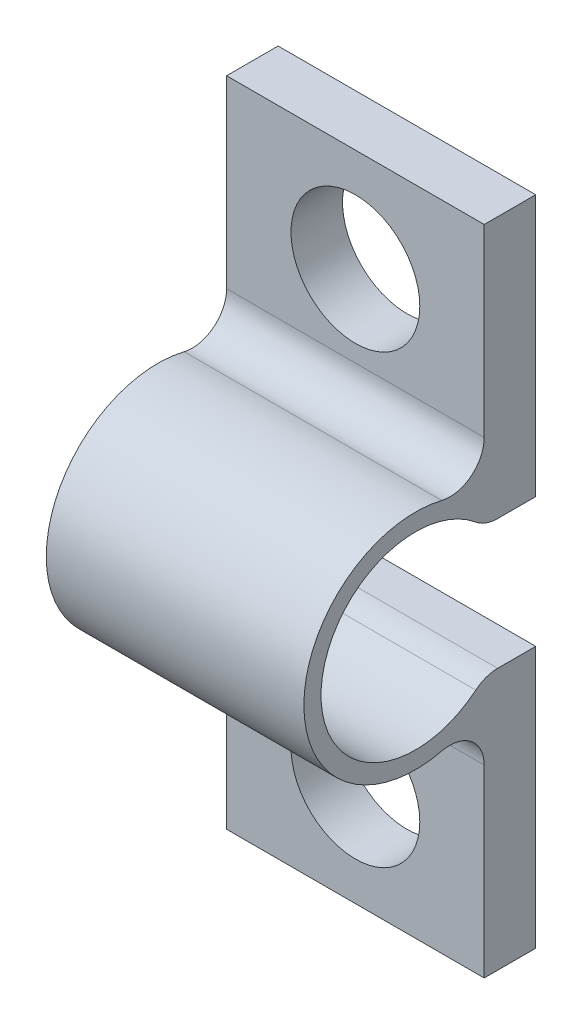
ISO-10303-21;
HEADER;
FILE_DESCRIPTION(('STEP AP214'),'2;1');
FILE_NAME('part.step','',(''),(''),'','','');
FILE_SCHEMA(('AUTOMOTIVE_DESIGN { 1 0 10303 214 1 1 1 1 }'));
ENDSEC;
DATA;
#1=APPLICATION_CONTEXT('core data for automotive mechanical design processes');
#2=APPLICATION_PROTOCOL_DEFINITION('international standard','automotive_design',2000,#1);
#3=PRODUCT_CONTEXT('',#1,'mechanical');
#4=PRODUCT('Part','Part','',(#3));
#5=PRODUCT_RELATED_PRODUCT_CATEGORY('part','',(#4));
#6=PRODUCT_DEFINITION_FORMATION('','',#4);
#7=PRODUCT_DEFINITION_CONTEXT('part definition',#1,'design');
#8=PRODUCT_DEFINITION('design','',#6,#7);
#9=PRODUCT_DEFINITION_SHAPE('','',#8);
#10=(LENGTH_UNIT() NAMED_UNIT(*) SI_UNIT(.MILLI.,.METRE.));
#11=(NAMED_UNIT(*) PLANE_ANGLE_UNIT() SI_UNIT($,.RADIAN.));
#12=(NAMED_UNIT(*) SI_UNIT($,.STERADIAN.) SOLID_ANGLE_UNIT());
#13=UNCERTAINTY_MEASURE_WITH_UNIT(LENGTH_MEASURE(1.E-05),#10,'distance_accuracy_value','');
#14=(GEOMETRIC_REPRESENTATION_CONTEXT(3) GLOBAL_UNCERTAINTY_ASSIGNED_CONTEXT((#13)) GLOBAL_UNIT_ASSIGNED_CONTEXT((#10,
#11,#12)) REPRESENTATION_CONTEXT('',''));
#15=CARTESIAN_POINT('',(0.,0.,0.));
#16=DIRECTION('',(0.,0.,1.));
#17=DIRECTION('',(1.,0.,0.));
#18=AXIS2_PLACEMENT_3D('',#15,#16,#17);
#19=CARTESIAN_POINT('',(0.,0.,0.));
#20=DIRECTION('',(0.,0.,-1.));
#21=DIRECTION('',(-1.,0.,0.));
#22=AXIS2_PLACEMENT_3D('',#19,#20,#21);
#23=PLANE('',#22);
#24=DIRECTION('',(1.,0.,0.));
#25=VECTOR('',#24,1.);
#26=CARTESIAN_POINT('',(0.,3.77491721763538,0.));
#27=LINE('',#26,#25);
#28=CARTESIAN_POINT('',(-35.5,3.77491721763538,0.));
#29=VERTEX_POINT('',#28);
#30=CARTESIAN_POINT('',(-20.5,3.77491721763538,0.));
#31=VERTEX_POINT('',#30);
#32=EDGE_CURVE('E180',#29,#31,#27,.T.);
#33=ORIENTED_EDGE('',*,*,#32,.F.);
#34=DIRECTION('',(0.,1.,0.));
#35=VECTOR('',#34,1.);
#36=CARTESIAN_POINT('',(-35.5,-19.,0.));
#37=LINE('',#36,#35);
#38=CARTESIAN_POINT('',(-35.5,19.,0.));
#39=VERTEX_POINT('',#38);
#40=EDGE_CURVE('E196',#29,#39,#37,.T.);
#41=ORIENTED_EDGE('',*,*,#40,.T.);
#42=DIRECTION('',(1.,0.,0.));
#43=VECTOR('',#42,1.);
#44=CARTESIAN_POINT('',(-35.5,19.,0.));
#45=LINE('',#44,#43);
#46=CARTESIAN_POINT('',(-20.5,19.,0.));
#47=VERTEX_POINT('',#46);
#48=EDGE_CURVE('E195',#39,#47,#45,.T.);
#49=ORIENTED_EDGE('',*,*,#48,.T.);
#50=DIRECTION('',(0.,-1.,0.));
#51=VECTOR('',#50,1.);
#52=CARTESIAN_POINT('',(-20.5,13.,0.));
#53=LINE('',#52,#51);
#54=EDGE_CURVE('E206',#47,#31,#53,.T.);
#55=ORIENTED_EDGE('',*,*,#54,.T.);
#56=EDGE_LOOP('',(#33,#41,#49,#55));
#57=FACE_BOUND('',#56,.T.);
#58=CARTESIAN_POINT('',(-28.,13.,0.));
#59=DIRECTION('',(0.,0.,1.));
#60=DIRECTION('',(1.,0.,0.));
#61=AXIS2_PLACEMENT_3D('',#58,#59,#60);
#62=CIRCLE('',#61,3.75);
#63=CARTESIAN_POINT('',(-24.25,13.,0.));
#64=VERTEX_POINT('',#63);
#65=EDGE_CURVE('E344',#64,#64,#62,.T.);
#66=ORIENTED_EDGE('',*,*,#65,.T.);
#67=EDGE_LOOP('',(#66));
#68=FACE_BOUND('',#67,.T.);
#69=ADVANCED_FACE('F72',(#57,#68),#23,.T.);
#70=CARTESIAN_POINT('',(0.,0.,3.));
#71=DIRECTION('',(0.,0.,-1.));
#72=DIRECTION('',(-1.,0.,0.));
#73=AXIS2_PLACEMENT_3D('',#70,#71,#72);
#74=PLANE('',#73);
#75=CARTESIAN_POINT('',(-28.,-13.,3.));
#76=DIRECTION('',(0.,0.,1.));
#77=DIRECTION('',(1.,0.,0.));
#78=AXIS2_PLACEMENT_3D('',#75,#76,#77);
#79=CIRCLE('',#78,3.75);
#80=CARTESIAN_POINT('',(-24.25,-13.,3.));
#81=VERTEX_POINT('',#80);
#82=EDGE_CURVE('E341',#81,#81,#79,.T.);
#83=ORIENTED_EDGE('',*,*,#82,.F.);
#84=EDGE_LOOP('',(#83));
#85=FACE_BOUND('',#84,.T.);
#86=DIRECTION('',(0.,1.,0.));
#87=VECTOR('',#86,1.);
#88=CARTESIAN_POINT('',(-20.5,13.,3.));
#89=LINE('',#88,#87);
#90=CARTESIAN_POINT('',(-20.5,-19.,3.));
#91=VERTEX_POINT('',#90);
#92=CARTESIAN_POINT('',(-20.5,-8.26135582092915,3.));
#93=VERTEX_POINT('',#92);
#94=EDGE_CURVE('E357',#91,#93,#89,.T.);
#95=ORIENTED_EDGE('',*,*,#94,.T.);
#96=DIRECTION('',(-1.,0.,0.));
#97=VECTOR('',#96,1.);
#98=CARTESIAN_POINT('',(0.,-8.26135582092915,3.));
#99=LINE('',#98,#97);
#100=CARTESIAN_POINT('',(-35.5,-8.26135582092915,3.));
#101=VERTEX_POINT('',#100);
#102=EDGE_CURVE('E229',#93,#101,#99,.T.);
#103=ORIENTED_EDGE('',*,*,#102,.T.);
#104=DIRECTION('',(0.,1.,0.));
#105=VECTOR('',#104,1.);
#106=CARTESIAN_POINT('',(-35.5,-19.,3.));
#107=LINE('',#106,#105);
#108=CARTESIAN_POINT('',(-35.5,-19.,3.));
#109=VERTEX_POINT('',#108);
#110=EDGE_CURVE('E351',#109,#101,#107,.T.);
#111=ORIENTED_EDGE('',*,*,#110,.F.);
#112=DIRECTION('',(1.,0.,0.));
#113=VECTOR('',#112,1.);
#114=CARTESIAN_POINT('',(-35.5,-19.,3.));
#115=LINE('',#114,#113);
#116=EDGE_CURVE('E203',#109,#91,#115,.T.);
#117=ORIENTED_EDGE('',*,*,#116,.T.);
#118=EDGE_LOOP('',(#95,#103,#111,#117));
#119=FACE_BOUND('',#118,.T.);
#120=ADVANCED_FACE('F275',(#85,#119),#74,.F.);
#121=CARTESIAN_POINT('',(-35.5,8.26135582092916,3.));
#122=VERTEX_POINT('',#121);
#123=CARTESIAN_POINT('',(-35.5,19.,3.));
#124=VERTEX_POINT('',#123);
#125=EDGE_CURVE('E210',#122,#124,#107,.T.);
#126=ORIENTED_EDGE('',*,*,#125,.F.);
#127=DIRECTION('',(-1.,0.,0.));
#128=VECTOR('',#127,1.);
#129=CARTESIAN_POINT('',(0.,8.26135582092915,3.));
#130=LINE('',#129,#128);
#131=CARTESIAN_POINT('',(-20.5,8.26135582092915,3.));
#132=VERTEX_POINT('',#131);
#133=EDGE_CURVE('E213',#122,#132,#130,.F.);
#134=ORIENTED_EDGE('',*,*,#133,.T.);
#135=CARTESIAN_POINT('',(-20.5,19.,3.));
#136=VERTEX_POINT('',#135);
#137=EDGE_CURVE('E356',#132,#136,#89,.T.);
#138=ORIENTED_EDGE('',*,*,#137,.T.);
#139=DIRECTION('',(1.,0.,0.));
#140=VECTOR('',#139,1.);
#141=CARTESIAN_POINT('',(-35.5,19.,3.));
#142=LINE('',#141,#140);
#143=EDGE_CURVE('E354',#124,#136,#142,.T.);
#144=ORIENTED_EDGE('',*,*,#143,.F.);
#145=EDGE_LOOP('',(#126,#134,#138,#144));
#146=FACE_BOUND('',#145,.T.);
#147=CARTESIAN_POINT('',(-28.,13.,3.));
#148=DIRECTION('',(0.,0.,1.));
#149=DIRECTION('',(1.,0.,0.));
#150=AXIS2_PLACEMENT_3D('',#147,#148,#149);
#151=CIRCLE('',#150,3.75);
#152=CARTESIAN_POINT('',(-24.25,13.,3.));
#153=VERTEX_POINT('',#152);
#154=EDGE_CURVE('E201',#153,#153,#151,.T.);
#155=ORIENTED_EDGE('',*,*,#154,.F.);
#156=EDGE_LOOP('',(#155));
#157=FACE_BOUND('',#156,.T.);
#158=ADVANCED_FACE('F281',(#146,#157),#74,.F.);
#159=DIRECTION('',(-1.,0.,0.));
#160=VECTOR('',#159,1.);
#161=CARTESIAN_POINT('',(0.,-3.77491721763537,0.));
#162=LINE('',#161,#160);
#163=CARTESIAN_POINT('',(-20.5,-3.77491721763537,0.));
#164=VERTEX_POINT('',#163);
#165=CARTESIAN_POINT('',(-35.5,-3.77491721763537,0.));
#166=VERTEX_POINT('',#165);
#167=EDGE_CURVE('E172',#164,#166,#162,.T.);
#168=ORIENTED_EDGE('',*,*,#167,.F.);
#169=CARTESIAN_POINT('',(-20.5,-19.,0.));
#170=VERTEX_POINT('',#169);
#171=EDGE_CURVE('E199',#164,#170,#53,.T.);
#172=ORIENTED_EDGE('',*,*,#171,.T.);
#173=DIRECTION('',(1.,0.,0.));
#174=VECTOR('',#173,1.);
#175=CARTESIAN_POINT('',(-35.5,-19.,0.));
#176=LINE('',#175,#174);
#177=CARTESIAN_POINT('',(-35.5,-19.,0.));
#178=VERTEX_POINT('',#177);
#179=EDGE_CURVE('E194',#178,#170,#176,.T.);
#180=ORIENTED_EDGE('',*,*,#179,.F.);
#181=EDGE_CURVE('E187',#178,#166,#37,.T.);
#182=ORIENTED_EDGE('',*,*,#181,.T.);
#183=EDGE_LOOP('',(#168,#172,#180,#182));
#184=FACE_BOUND('',#183,.T.);
#185=CARTESIAN_POINT('',(-28.,-13.,0.));
#186=DIRECTION('',(0.,0.,1.));
#187=DIRECTION('',(1.,0.,0.));
#188=AXIS2_PLACEMENT_3D('',#185,#186,#187);
#189=CIRCLE('',#188,3.75);
#190=CARTESIAN_POINT('',(-24.25,-13.,0.));
#191=VERTEX_POINT('',#190);
#192=EDGE_CURVE('E338',#191,#191,#189,.T.);
#193=ORIENTED_EDGE('',*,*,#192,.T.);
#194=EDGE_LOOP('',(#193));
#195=FACE_BOUND('',#194,.T.);
#196=ADVANCED_FACE('F191',(#184,#195),#23,.T.);
#197=CARTESIAN_POINT('',(-35.5,-19.,3.));
#198=DIRECTION('',(-1.,0.,0.));
#199=DIRECTION('',(0.,0.,1.));
#200=AXIS2_PLACEMENT_3D('',#197,#198,#199);
#201=PLANE('',#200);
#202=CARTESIAN_POINT('',(-35.5,0.,7.));
#203=DIRECTION('',(-1.,0.,0.));
#204=DIRECTION('',(0.,0.,1.));
#205=AXIS2_PLACEMENT_3D('',#202,#203,#204);
#206=CIRCLE('',#205,5.5);
#207=CARTESIAN_POINT('',(-35.5,-4.23493929293261,3.4906853681701));
#208=VERTEX_POINT('',#207);
#209=CARTESIAN_POINT('',(-35.5,4.23493929293261,3.4906853681701));
#210=VERTEX_POINT('',#209);
#211=EDGE_CURVE('E261',#208,#210,#206,.T.);
#212=ORIENTED_EDGE('',*,*,#211,.F.);
#213=CARTESIAN_POINT('',(-35.5,-5.77491721763537,2.21457095659558));
#214=DIRECTION('',(-1.,0.,0.));
#215=DIRECTION('',(0.,0.,1.));
#216=AXIS2_PLACEMENT_3D('',#213,#214,#215);
#217=CIRCLE('',#216,2.);
#218=CARTESIAN_POINT('',(-35.5,-3.77491721763537,2.21457095659558));
#219=VERTEX_POINT('',#218);
#220=EDGE_CURVE('E188',#208,#219,#217,.T.);
#221=ORIENTED_EDGE('',*,*,#220,.T.);
#222=DIRECTION('',(0.,0.,1.));
#223=VECTOR('',#222,1.);
#224=CARTESIAN_POINT('',(-35.5,-3.77491721763537,-12.));
#225=LINE('',#224,#223);
#226=EDGE_CURVE('E175',#166,#219,#225,.T.);
#227=ORIENTED_EDGE('',*,*,#226,.F.);
#228=ORIENTED_EDGE('',*,*,#181,.F.);
#229=DIRECTION('',(0.,0.,-1.));
#230=VECTOR('',#229,1.);
#231=CARTESIAN_POINT('',(-35.5,-19.,3.));
#232=LINE('',#231,#230);
#233=EDGE_CURVE('E211',#109,#178,#232,.T.);
#234=ORIENTED_EDGE('',*,*,#233,.F.);
#235=ORIENTED_EDGE('',*,*,#110,.T.);
#236=CARTESIAN_POINT('',(-35.5,-8.26135582092915,5.));
#237=DIRECTION('',(-1.,0.,0.));
#238=DIRECTION('',(0.,0.,1.));
#239=AXIS2_PLACEMENT_3D('',#236,#237,#238);
#240=CIRCLE('',#239,2.);
#241=CARTESIAN_POINT('',(-35.5,-6.31750739247523,5.47058823529412));
#242=VERTEX_POINT('',#241);
#243=EDGE_CURVE('E236',#101,#242,#240,.F.);
#244=ORIENTED_EDGE('',*,*,#243,.T.);
#245=CARTESIAN_POINT('',(-35.5,0.,7.));
#246=DIRECTION('',(-1.,0.,0.));
#247=DIRECTION('',(0.,0.,1.));
#248=AXIS2_PLACEMENT_3D('',#245,#246,#247);
#249=CIRCLE('',#248,6.5);
#250=CARTESIAN_POINT('',(-35.5,6.31750739247524,5.47058823529412));
#251=VERTEX_POINT('',#250);
#252=EDGE_CURVE('E260',#242,#251,#249,.T.);
#253=ORIENTED_EDGE('',*,*,#252,.T.);
#254=CARTESIAN_POINT('',(-35.5,8.26135582092915,5.));
#255=DIRECTION('',(-1.,0.,0.));
#256=DIRECTION('',(0.,0.,1.));
#257=AXIS2_PLACEMENT_3D('',#254,#255,#256);
#258=CIRCLE('',#257,2.);
#259=EDGE_CURVE('E234',#251,#122,#258,.F.);
#260=ORIENTED_EDGE('',*,*,#259,.T.);
#261=ORIENTED_EDGE('',*,*,#125,.T.);
#262=DIRECTION('',(0.,0.,-1.));
#263=VECTOR('',#262,1.);
#264=CARTESIAN_POINT('',(-35.5,19.,3.));
#265=LINE('',#264,#263);
#266=EDGE_CURVE('E220',#124,#39,#265,.T.);
#267=ORIENTED_EDGE('',*,*,#266,.T.);
#268=ORIENTED_EDGE('',*,*,#40,.F.);
#269=DIRECTION('',(0.,0.,1.));
#270=VECTOR('',#269,1.);
#271=CARTESIAN_POINT('',(-35.5,3.77491721763538,-12.));
#272=LINE('',#271,#270);
#273=CARTESIAN_POINT('',(-35.5,3.77491721763538,2.21457095659558));
#274=VERTEX_POINT('',#273);
#275=EDGE_CURVE('E181',#29,#274,#272,.T.);
#276=ORIENTED_EDGE('',*,*,#275,.T.);
#277=CARTESIAN_POINT('',(-35.5,5.77491721763538,2.21457095659558));
#278=DIRECTION('',(-1.,0.,0.));
#279=DIRECTION('',(0.,0.,1.));
#280=AXIS2_PLACEMENT_3D('',#277,#278,#279);
#281=CIRCLE('',#280,2.);
#282=EDGE_CURVE('E246',#274,#210,#281,.T.);
#283=ORIENTED_EDGE('',*,*,#282,.T.);
#284=EDGE_LOOP('',(#212,#221,#227,#228,#234,#235,#244,#253,#260,#261,#267,#268,#276,#283));
#285=FACE_BOUND('',#284,.T.);
#286=ADVANCED_FACE('F186',(#285),#201,.T.);
#287=CARTESIAN_POINT('',(-35.5,-19.,3.));
#288=DIRECTION('',(0.,1.,0.));
#289=DIRECTION('',(0.,0.,1.));
#290=AXIS2_PLACEMENT_3D('',#287,#288,#289);
#291=PLANE('',#290);
#292=ORIENTED_EDGE('',*,*,#179,.T.);
#293=DIRECTION('',(0.,0.,-1.));
#294=VECTOR('',#293,1.);
#295=CARTESIAN_POINT('',(-20.5,-19.,3.));
#296=LINE('',#295,#294);
#297=EDGE_CURVE('E214',#91,#170,#296,.T.);
#298=ORIENTED_EDGE('',*,*,#297,.F.);
#299=ORIENTED_EDGE('',*,*,#116,.F.);
#300=ORIENTED_EDGE('',*,*,#233,.T.);
#301=EDGE_LOOP('',(#292,#298,#299,#300));
#302=FACE_BOUND('',#301,.T.);
#303=ADVANCED_FACE('F293',(#302),#291,.F.);
#304=CARTESIAN_POINT('',(-20.5,13.,3.));
#305=DIRECTION('',(1.,0.,0.));
#306=DIRECTION('',(0.,0.,-1.));
#307=AXIS2_PLACEMENT_3D('',#304,#305,#306);
#308=PLANE('',#307);
#309=DIRECTION('',(0.,0.,1.));
#310=VECTOR('',#309,1.);
#311=CARTESIAN_POINT('',(-20.5,-3.77491721763537,-12.));
#312=LINE('',#311,#310);
#313=CARTESIAN_POINT('',(-20.5,-3.77491721763537,2.21457095659558));
#314=VERTEX_POINT('',#313);
#315=EDGE_CURVE('E176',#164,#314,#312,.T.);
#316=ORIENTED_EDGE('',*,*,#315,.T.);
#317=CARTESIAN_POINT('',(-20.5,-5.77491721763537,2.21457095659558));
#318=DIRECTION('',(1.,0.,0.));
#319=DIRECTION('',(0.,0.,-1.));
#320=AXIS2_PLACEMENT_3D('',#317,#318,#319);
#321=CIRCLE('',#320,2.);
#322=CARTESIAN_POINT('',(-20.5,-4.23493929293261,3.4906853681701));
#323=VERTEX_POINT('',#322);
#324=EDGE_CURVE('E80',#314,#323,#321,.T.);
#325=ORIENTED_EDGE('',*,*,#324,.T.);
#326=CARTESIAN_POINT('',(-20.5,0.,7.));
#327=DIRECTION('',(-1.,0.,0.));
#328=DIRECTION('',(0.,0.,1.));
#329=AXIS2_PLACEMENT_3D('',#326,#327,#328);
#330=CIRCLE('',#329,5.5);
#331=CARTESIAN_POINT('',(-20.5,4.23493929293261,3.4906853681701));
#332=VERTEX_POINT('',#331);
#333=EDGE_CURVE('E253',#323,#332,#330,.T.);
#334=ORIENTED_EDGE('',*,*,#333,.T.);
#335=CARTESIAN_POINT('',(-20.5,5.77491721763538,2.21457095659558));
#336=DIRECTION('',(1.,0.,0.));
#337=DIRECTION('',(0.,0.,-1.));
#338=AXIS2_PLACEMENT_3D('',#335,#336,#337);
#339=CIRCLE('',#338,2.);
#340=CARTESIAN_POINT('',(-20.5,3.77491721763538,2.21457095659558));
#341=VERTEX_POINT('',#340);
#342=EDGE_CURVE('E87',#332,#341,#339,.T.);
#343=ORIENTED_EDGE('',*,*,#342,.T.);
#344=DIRECTION('',(0.,0.,1.));
#345=VECTOR('',#344,1.);
#346=CARTESIAN_POINT('',(-20.5,3.77491721763538,-12.));
#347=LINE('',#346,#345);
#348=EDGE_CURVE('E326',#31,#341,#347,.T.);
#349=ORIENTED_EDGE('',*,*,#348,.F.);
#350=ORIENTED_EDGE('',*,*,#54,.F.);
#351=DIRECTION('',(0.,0.,-1.));
#352=VECTOR('',#351,1.);
#353=CARTESIAN_POINT('',(-20.5,19.,3.));
#354=LINE('',#353,#352);
#355=EDGE_CURVE('E217',#136,#47,#354,.T.);
#356=ORIENTED_EDGE('',*,*,#355,.F.);
#357=ORIENTED_EDGE('',*,*,#137,.F.);
#358=CARTESIAN_POINT('',(-20.5,8.26135582092915,5.));
#359=DIRECTION('',(1.,0.,0.));
#360=DIRECTION('',(0.,0.,-1.));
#361=AXIS2_PLACEMENT_3D('',#358,#359,#360);
#362=CIRCLE('',#361,2.);
#363=CARTESIAN_POINT('',(-20.5,6.31750739247524,5.47058823529412));
#364=VERTEX_POINT('',#363);
#365=EDGE_CURVE('E232',#132,#364,#362,.F.);
#366=ORIENTED_EDGE('',*,*,#365,.T.);
#367=CARTESIAN_POINT('',(-20.5,0.,7.));
#368=DIRECTION('',(-1.,0.,0.));
#369=DIRECTION('',(0.,0.,1.));
#370=AXIS2_PLACEMENT_3D('',#367,#368,#369);
#371=CIRCLE('',#370,6.5);
#372=CARTESIAN_POINT('',(-20.5,-6.31750739247523,5.47058823529412));
#373=VERTEX_POINT('',#372);
#374=EDGE_CURVE('E335',#373,#364,#371,.T.);
#375=ORIENTED_EDGE('',*,*,#374,.F.);
#376=CARTESIAN_POINT('',(-20.5,-8.26135582092915,5.));
#377=DIRECTION('',(1.,0.,0.));
#378=DIRECTION('',(0.,0.,-1.));
#379=AXIS2_PLACEMENT_3D('',#376,#377,#378);
#380=CIRCLE('',#379,2.);
#381=EDGE_CURVE('E238',#373,#93,#380,.F.);
#382=ORIENTED_EDGE('',*,*,#381,.T.);
#383=ORIENTED_EDGE('',*,*,#94,.F.);
#384=ORIENTED_EDGE('',*,*,#297,.T.);
#385=ORIENTED_EDGE('',*,*,#171,.F.);
#386=EDGE_LOOP('',(#316,#325,#334,#343,#349,#350,#356,#357,#366,#375,#382,#383,#384,#385));
#387=FACE_BOUND('',#386,.T.);
#388=ADVANCED_FACE('F252',(#387),#308,.T.);
#389=CARTESIAN_POINT('',(-35.5,19.,3.));
#390=DIRECTION('',(0.,1.,0.));
#391=DIRECTION('',(0.,0.,1.));
#392=AXIS2_PLACEMENT_3D('',#389,#390,#391);
#393=PLANE('',#392);
#394=ORIENTED_EDGE('',*,*,#48,.F.);
#395=ORIENTED_EDGE('',*,*,#266,.F.);
#396=ORIENTED_EDGE('',*,*,#143,.T.);
#397=ORIENTED_EDGE('',*,*,#355,.T.);
#398=EDGE_LOOP('',(#394,#395,#396,#397));
#399=FACE_BOUND('',#398,.T.);
#400=ADVANCED_FACE('F305',(#399),#393,.T.);
#401=CARTESIAN_POINT('',(-28.,13.,3.));
#402=DIRECTION('',(0.,0.,-1.));
#403=DIRECTION('',(-1.,0.,0.));
#404=AXIS2_PLACEMENT_3D('',#401,#402,#403);
#405=CYLINDRICAL_SURFACE('',#404,3.75);
#406=ORIENTED_EDGE('',*,*,#154,.T.);
#407=EDGE_LOOP('',(#406));
#408=FACE_BOUND('',#407,.T.);
#409=ORIENTED_EDGE('',*,*,#65,.F.);
#410=EDGE_LOOP('',(#409));
#411=FACE_BOUND('',#410,.T.);
#412=ADVANCED_FACE('F301',(#408,#411),#405,.F.);
#413=CARTESIAN_POINT('',(-28.,-13.,3.));
#414=DIRECTION('',(0.,0.,-1.));
#415=DIRECTION('',(-1.,0.,0.));
#416=AXIS2_PLACEMENT_3D('',#413,#414,#415);
#417=CYLINDRICAL_SURFACE('',#416,3.75);
#418=ORIENTED_EDGE('',*,*,#82,.T.);
#419=EDGE_LOOP('',(#418));
#420=FACE_BOUND('',#419,.T.);
#421=ORIENTED_EDGE('',*,*,#192,.F.);
#422=EDGE_LOOP('',(#421));
#423=FACE_BOUND('',#422,.T.);
#424=ADVANCED_FACE('F304',(#420,#423),#417,.F.);
#425=CARTESIAN_POINT('',(-20.5,0.,7.));
#426=DIRECTION('',(-1.,0.,0.));
#427=DIRECTION('',(0.,0.,1.));
#428=AXIS2_PLACEMENT_3D('',#425,#426,#427);
#429=CYLINDRICAL_SURFACE('',#428,6.5);
#430=ORIENTED_EDGE('',*,*,#374,.T.);
#431=DIRECTION('',(-1.,0.,0.));
#432=VECTOR('',#431,1.);
#433=CARTESIAN_POINT('',(-20.5,6.31750739247524,5.47058823529412));
#434=LINE('',#433,#432);
#435=EDGE_CURVE('E227',#364,#251,#434,.T.);
#436=ORIENTED_EDGE('',*,*,#435,.T.);
#437=ORIENTED_EDGE('',*,*,#252,.F.);
#438=DIRECTION('',(-1.,0.,0.));
#439=VECTOR('',#438,1.);
#440=CARTESIAN_POINT('',(-20.5,-6.31750739247523,5.47058823529412));
#441=LINE('',#440,#439);
#442=EDGE_CURVE('E225',#242,#373,#441,.F.);
#443=ORIENTED_EDGE('',*,*,#442,.T.);
#444=EDGE_LOOP('',(#430,#436,#437,#443));
#445=FACE_BOUND('',#444,.T.);
#446=ADVANCED_FACE('F309',(#445),#429,.T.);
#447=CARTESIAN_POINT('',(-20.5,0.,7.));
#448=DIRECTION('',(-1.,0.,0.));
#449=DIRECTION('',(0.,0.,1.));
#450=AXIS2_PLACEMENT_3D('',#447,#448,#449);
#451=CYLINDRICAL_SURFACE('',#450,5.5);
#452=ORIENTED_EDGE('',*,*,#333,.F.);
#453=DIRECTION('',(-1.,0.,0.));
#454=VECTOR('',#453,1.);
#455=CARTESIAN_POINT('',(-20.5,-4.23493929293261,3.49068536817009));
#456=LINE('',#455,#454);
#457=EDGE_CURVE('E243',#323,#208,#456,.T.);
#458=ORIENTED_EDGE('',*,*,#457,.T.);
#459=ORIENTED_EDGE('',*,*,#211,.T.);
#460=DIRECTION('',(-1.,0.,0.));
#461=VECTOR('',#460,1.);
#462=CARTESIAN_POINT('',(-20.5,4.23493929293261,3.49068536817009));
#463=LINE('',#462,#461);
#464=EDGE_CURVE('E240',#210,#332,#463,.F.);
#465=ORIENTED_EDGE('',*,*,#464,.T.);
#466=EDGE_LOOP('',(#452,#458,#459,#465));
#467=FACE_BOUND('',#466,.T.);
#468=ADVANCED_FACE('F257',(#467),#451,.F.);
#469=CARTESIAN_POINT('',(-35.5,-3.77491721763537,-12.));
#470=DIRECTION('',(0.,-1.,0.));
#471=DIRECTION('',(0.,0.,-1.));
#472=AXIS2_PLACEMENT_3D('',#469,#470,#471);
#473=PLANE('',#472);
#474=ORIENTED_EDGE('',*,*,#226,.T.);
#475=DIRECTION('',(-1.,0.,0.));
#476=VECTOR('',#475,1.);
#477=CARTESIAN_POINT('',(-35.5,-3.77491721763537,2.21457095659558));
#478=LINE('',#477,#476);
#479=EDGE_CURVE('E95',#219,#314,#478,.F.);
#480=ORIENTED_EDGE('',*,*,#479,.T.);
#481=ORIENTED_EDGE('',*,*,#315,.F.);
#482=ORIENTED_EDGE('',*,*,#167,.T.);
#483=EDGE_LOOP('',(#474,#480,#481,#482));
#484=FACE_BOUND('',#483,.T.);
#485=ADVANCED_FACE('F174',(#484),#473,.F.);
#486=CARTESIAN_POINT('',(-35.5,3.77491721763538,-12.));
#487=DIRECTION('',(0.,1.,0.));
#488=DIRECTION('',(0.,0.,1.));
#489=AXIS2_PLACEMENT_3D('',#486,#487,#488);
#490=PLANE('',#489);
#491=ORIENTED_EDGE('',*,*,#348,.T.);
#492=DIRECTION('',(-1.,0.,0.));
#493=VECTOR('',#492,1.);
#494=CARTESIAN_POINT('',(-35.5,3.77491721763538,2.21457095659558));
#495=LINE('',#494,#493);
#496=EDGE_CURVE('E12',#341,#274,#495,.T.);
#497=ORIENTED_EDGE('',*,*,#496,.T.);
#498=ORIENTED_EDGE('',*,*,#275,.F.);
#499=ORIENTED_EDGE('',*,*,#32,.T.);
#500=EDGE_LOOP('',(#491,#497,#498,#499));
#501=FACE_BOUND('',#500,.T.);
#502=ADVANCED_FACE('F318',(#501),#490,.F.);
#503=CARTESIAN_POINT('',(-20.5,8.26135582092915,5.));
#504=DIRECTION('',(-1.,0.,0.));
#505=DIRECTION('',(0.,0.,1.));
#506=AXIS2_PLACEMENT_3D('',#503,#504,#505);
#507=CYLINDRICAL_SURFACE('',#506,2.);
#508=ORIENTED_EDGE('',*,*,#259,.F.);
#509=ORIENTED_EDGE('',*,*,#435,.F.);
#510=ORIENTED_EDGE('',*,*,#365,.F.);
#511=ORIENTED_EDGE('',*,*,#133,.F.);
#512=EDGE_LOOP('',(#508,#509,#510,#511));
#513=FACE_BOUND('',#512,.T.);
#514=ADVANCED_FACE('F271',(#513),#507,.F.);
#515=CARTESIAN_POINT('',(-20.5,-8.26135582092915,5.));
#516=DIRECTION('',(-1.,0.,0.));
#517=DIRECTION('',(0.,0.,1.));
#518=AXIS2_PLACEMENT_3D('',#515,#516,#517);
#519=CYLINDRICAL_SURFACE('',#518,2.);
#520=ORIENTED_EDGE('',*,*,#381,.F.);
#521=ORIENTED_EDGE('',*,*,#442,.F.);
#522=ORIENTED_EDGE('',*,*,#243,.F.);
#523=ORIENTED_EDGE('',*,*,#102,.F.);
#524=EDGE_LOOP('',(#520,#521,#522,#523));
#525=FACE_BOUND('',#524,.T.);
#526=ADVANCED_FACE('F265',(#525),#519,.F.);
#527=CARTESIAN_POINT('',(-20.5,-5.77491721763537,2.21457095659558));
#528=DIRECTION('',(-1.,0.,0.));
#529=DIRECTION('',(0.,0.,1.));
#530=AXIS2_PLACEMENT_3D('',#527,#528,#529);
#531=CYLINDRICAL_SURFACE('',#530,2.);
#532=ORIENTED_EDGE('',*,*,#324,.F.);
#533=ORIENTED_EDGE('',*,*,#479,.F.);
#534=ORIENTED_EDGE('',*,*,#220,.F.);
#535=ORIENTED_EDGE('',*,*,#457,.F.);
#536=EDGE_LOOP('',(#532,#533,#534,#535));
#537=FACE_BOUND('',#536,.T.);
#538=ADVANCED_FACE('F263',(#537),#531,.T.);
#539=CARTESIAN_POINT('',(-20.5,5.77491721763538,2.21457095659558));
#540=DIRECTION('',(-1.,0.,0.));
#541=DIRECTION('',(0.,0.,1.));
#542=AXIS2_PLACEMENT_3D('',#539,#540,#541);
#543=CYLINDRICAL_SURFACE('',#542,2.);
#544=ORIENTED_EDGE('',*,*,#282,.F.);
#545=ORIENTED_EDGE('',*,*,#496,.F.);
#546=ORIENTED_EDGE('',*,*,#342,.F.);
#547=ORIENTED_EDGE('',*,*,#464,.F.);
#548=EDGE_LOOP('',(#544,#545,#546,#547));
#549=FACE_BOUND('',#548,.T.);
#550=ADVANCED_FACE('F74',(#549),#543,.T.);
#551=CLOSED_SHELL('',(#69,#120,#158,#196,#286,#303,#388,#400,#412,#424,#446,#468,#485,#502,#514,
#526,#538,#550));
#552=MANIFOLD_SOLID_BREP('B2',#551);
#553=ADVANCED_BREP_SHAPE_REPRESENTATION('',(#18,#552),#14);
#554=SHAPE_DEFINITION_REPRESENTATION(#9,#553);
ENDSEC;
END-ISO-10303-21;
